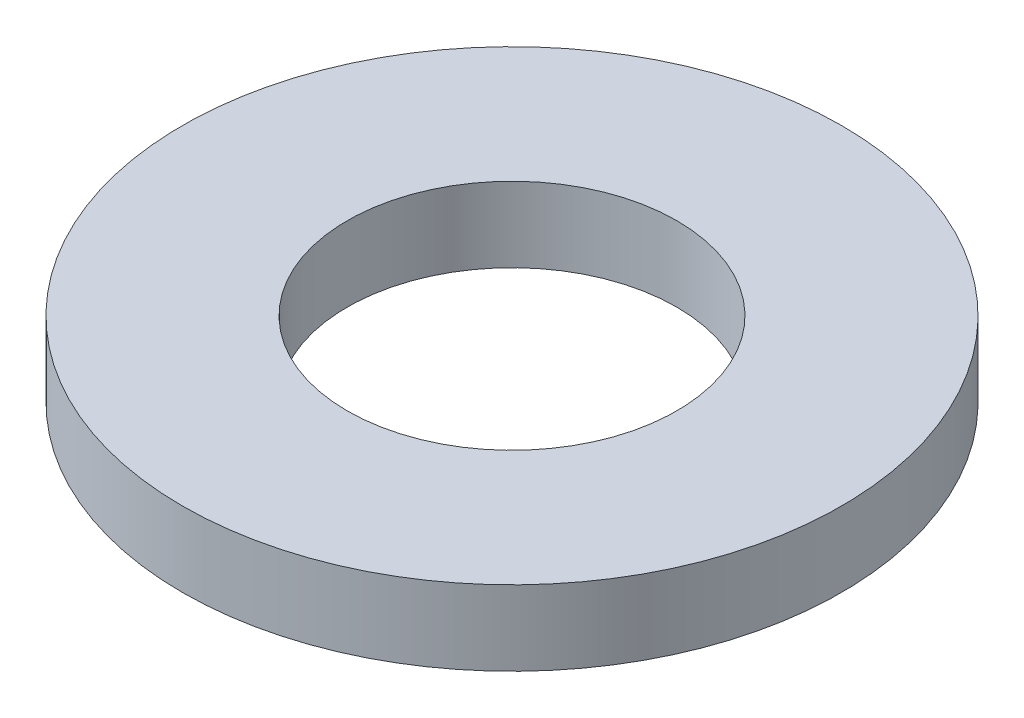
ISO-10303-21;
HEADER;
FILE_DESCRIPTION(('STEP AP214'),'2;1');
FILE_NAME('part.step','',(''),(''),'','','');
FILE_SCHEMA(('AUTOMOTIVE_DESIGN { 1 0 10303 214 1 1 1 1 }'));
ENDSEC;
DATA;
#1=APPLICATION_CONTEXT('core data for automotive mechanical design processes');
#2=APPLICATION_PROTOCOL_DEFINITION('international standard','automotive_design',2000,#1);
#3=PRODUCT_CONTEXT('',#1,'mechanical');
#4=PRODUCT('Part','Part','',(#3));
#5=PRODUCT_RELATED_PRODUCT_CATEGORY('part','',(#4));
#6=PRODUCT_DEFINITION_FORMATION('','',#4);
#7=PRODUCT_DEFINITION_CONTEXT('part definition',#1,'design');
#8=PRODUCT_DEFINITION('design','',#6,#7);
#9=PRODUCT_DEFINITION_SHAPE('','',#8);
#10=(LENGTH_UNIT() NAMED_UNIT(*) SI_UNIT(.MILLI.,.METRE.));
#11=(NAMED_UNIT(*) PLANE_ANGLE_UNIT() SI_UNIT($,.RADIAN.));
#12=(NAMED_UNIT(*) SI_UNIT($,.STERADIAN.) SOLID_ANGLE_UNIT());
#13=UNCERTAINTY_MEASURE_WITH_UNIT(LENGTH_MEASURE(1.E-05),#10,'distance_accuracy_value','');
#14=(GEOMETRIC_REPRESENTATION_CONTEXT(3) GLOBAL_UNCERTAINTY_ASSIGNED_CONTEXT((#13)) GLOBAL_UNIT_ASSIGNED_CONTEXT((#10,
#11,#12)) REPRESENTATION_CONTEXT('',''));
#15=CARTESIAN_POINT('',(0.,0.,0.));
#16=DIRECTION('',(0.,0.,1.));
#17=DIRECTION('',(1.,0.,0.));
#18=AXIS2_PLACEMENT_3D('',#15,#16,#17);
#19=CARTESIAN_POINT('',(0.,12.5,0.));
#20=DIRECTION('',(0.,1.,0.));
#21=DIRECTION('',(0.,0.,1.));
#22=AXIS2_PLACEMENT_3D('',#19,#20,#21);
#23=PLANE('',#22);
#24=CARTESIAN_POINT('',(0.,12.5,0.));
#25=DIRECTION('',(0.,1.,0.));
#26=DIRECTION('',(0.,0.,1.));
#27=AXIS2_PLACEMENT_3D('',#24,#25,#26);
#28=CIRCLE('',#27,110.);
#29=CARTESIAN_POINT('',(0.,12.5,110.));
#30=VERTEX_POINT('',#29);
#31=EDGE_CURVE('E11',#30,#30,#28,.T.);
#32=ORIENTED_EDGE('',*,*,#31,.T.);
#33=EDGE_LOOP('',(#32));
#34=FACE_BOUND('',#33,.T.);
#35=CARTESIAN_POINT('',(0.,12.5,0.));
#36=DIRECTION('',(0.,1.,0.));
#37=DIRECTION('',(0.,0.,1.));
#38=AXIS2_PLACEMENT_3D('',#35,#36,#37);
#39=CIRCLE('',#38,55.);
#40=CARTESIAN_POINT('',(0.,12.5,55.));
#41=VERTEX_POINT('',#40);
#42=EDGE_CURVE('E47',#41,#41,#39,.T.);
#43=ORIENTED_EDGE('',*,*,#42,.F.);
#44=EDGE_LOOP('',(#43));
#45=FACE_BOUND('',#44,.T.);
#46=ADVANCED_FACE('F35',(#34,#45),#23,.T.);
#47=CARTESIAN_POINT('',(0.,-12.5,0.));
#48=DIRECTION('',(0.,1.,0.));
#49=DIRECTION('',(0.,0.,1.));
#50=AXIS2_PLACEMENT_3D('',#47,#48,#49);
#51=PLANE('',#50);
#52=CARTESIAN_POINT('',(0.,-12.5,0.));
#53=DIRECTION('',(0.,1.,0.));
#54=DIRECTION('',(0.,0.,1.));
#55=AXIS2_PLACEMENT_3D('',#52,#53,#54);
#56=CIRCLE('',#55,110.);
#57=CARTESIAN_POINT('',(0.,-12.5,110.));
#58=VERTEX_POINT('',#57);
#59=EDGE_CURVE('E39',#58,#58,#56,.T.);
#60=ORIENTED_EDGE('',*,*,#59,.F.);
#61=EDGE_LOOP('',(#60));
#62=FACE_BOUND('',#61,.T.);
#63=CARTESIAN_POINT('',(0.,-12.5,0.));
#64=DIRECTION('',(0.,1.,0.));
#65=DIRECTION('',(0.,0.,1.));
#66=AXIS2_PLACEMENT_3D('',#63,#64,#65);
#67=CIRCLE('',#66,55.);
#68=CARTESIAN_POINT('',(0.,-12.5,55.));
#69=VERTEX_POINT('',#68);
#70=EDGE_CURVE('E49',#69,#69,#67,.T.);
#71=ORIENTED_EDGE('',*,*,#70,.T.);
#72=EDGE_LOOP('',(#71));
#73=FACE_BOUND('',#72,.T.);
#74=ADVANCED_FACE('F61',(#62,#73),#51,.F.);
#75=CARTESIAN_POINT('',(0.,12.5,0.));
#76=DIRECTION('',(0.,-1.,0.));
#77=DIRECTION('',(0.,0.,-1.));
#78=AXIS2_PLACEMENT_3D('',#75,#76,#77);
#79=CYLINDRICAL_SURFACE('',#78,110.);
#80=ORIENTED_EDGE('',*,*,#31,.F.);
#81=EDGE_LOOP('',(#80));
#82=FACE_BOUND('',#81,.T.);
#83=ORIENTED_EDGE('',*,*,#59,.T.);
#84=EDGE_LOOP('',(#83));
#85=FACE_BOUND('',#84,.T.);
#86=ADVANCED_FACE('F37',(#82,#85),#79,.T.);
#87=CARTESIAN_POINT('',(0.,12.5,0.));
#88=DIRECTION('',(0.,-1.,0.));
#89=DIRECTION('',(0.,0.,-1.));
#90=AXIS2_PLACEMENT_3D('',#87,#88,#89);
#91=CYLINDRICAL_SURFACE('',#90,55.);
#92=ORIENTED_EDGE('',*,*,#42,.T.);
#93=EDGE_LOOP('',(#92));
#94=FACE_BOUND('',#93,.T.);
#95=ORIENTED_EDGE('',*,*,#70,.F.);
#96=EDGE_LOOP('',(#95));
#97=FACE_BOUND('',#96,.T.);
#98=ADVANCED_FACE('F63',(#94,#97),#91,.F.);
#99=CLOSED_SHELL('',(#46,#74,#86,#98));
#100=MANIFOLD_SOLID_BREP('B2',#99);
#101=ADVANCED_BREP_SHAPE_REPRESENTATION('',(#18,#100),#14);
#102=SHAPE_DEFINITION_REPRESENTATION(#9,#101);
ENDSEC;
END-ISO-10303-21;
